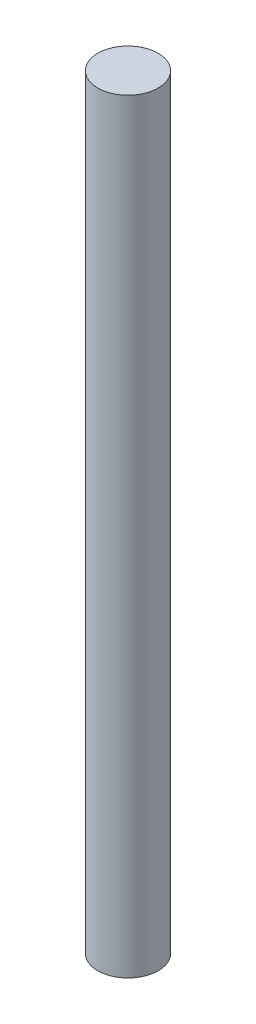
ISO-10303-21;
HEADER;
FILE_DESCRIPTION(('STEP AP214'),'2;1');
FILE_NAME('part.step','',(''),(''),'','','');
FILE_SCHEMA(('AUTOMOTIVE_DESIGN { 1 0 10303 214 1 1 1 1 }'));
ENDSEC;
DATA;
#1=APPLICATION_CONTEXT('core data for automotive mechanical design processes');
#2=APPLICATION_PROTOCOL_DEFINITION('international standard','automotive_design',2000,#1);
#3=PRODUCT_CONTEXT('',#1,'mechanical');
#4=PRODUCT('Part','Part','',(#3));
#5=PRODUCT_RELATED_PRODUCT_CATEGORY('part','',(#4));
#6=PRODUCT_DEFINITION_FORMATION('','',#4);
#7=PRODUCT_DEFINITION_CONTEXT('part definition',#1,'design');
#8=PRODUCT_DEFINITION('design','',#6,#7);
#9=PRODUCT_DEFINITION_SHAPE('','',#8);
#10=(LENGTH_UNIT() NAMED_UNIT(*) SI_UNIT(.MILLI.,.METRE.));
#11=(NAMED_UNIT(*) PLANE_ANGLE_UNIT() SI_UNIT($,.RADIAN.));
#12=(NAMED_UNIT(*) SI_UNIT($,.STERADIAN.) SOLID_ANGLE_UNIT());
#13=UNCERTAINTY_MEASURE_WITH_UNIT(LENGTH_MEASURE(1.E-05),#10,'distance_accuracy_value','');
#14=(GEOMETRIC_REPRESENTATION_CONTEXT(3) GLOBAL_UNCERTAINTY_ASSIGNED_CONTEXT((#13)) GLOBAL_UNIT_ASSIGNED_CONTEXT((#10,
#11,#12)) REPRESENTATION_CONTEXT('',''));
#15=CARTESIAN_POINT('',(0.,0.,0.));
#16=DIRECTION('',(0.,0.,1.));
#17=DIRECTION('',(1.,0.,0.));
#18=AXIS2_PLACEMENT_3D('',#15,#16,#17);
#19=CARTESIAN_POINT('',(0.,38.,0.));
#20=DIRECTION('',(0.,-1.,0.));
#21=DIRECTION('',(0.,0.,-1.));
#22=AXIS2_PLACEMENT_3D('',#19,#20,#21);
#23=CYLINDRICAL_SURFACE('',#22,1.5);
#24=CARTESIAN_POINT('',(0.,38.,0.));
#25=DIRECTION('',(0.,1.,0.));
#26=DIRECTION('',(0.,0.,1.));
#27=AXIS2_PLACEMENT_3D('',#24,#25,#26);
#28=CIRCLE('',#27,1.5);
#29=CARTESIAN_POINT('',(0.,38.,1.5));
#30=VERTEX_POINT('',#29);
#31=EDGE_CURVE('E10',#30,#30,#28,.T.);
#32=ORIENTED_EDGE('',*,*,#31,.F.);
#33=EDGE_LOOP('',(#32));
#34=FACE_BOUND('',#33,.T.);
#35=CARTESIAN_POINT('',(0.,0.,0.));
#36=DIRECTION('',(0.,1.,0.));
#37=DIRECTION('',(0.,0.,1.));
#38=AXIS2_PLACEMENT_3D('',#35,#36,#37);
#39=CIRCLE('',#38,1.5);
#40=CARTESIAN_POINT('',(0.,0.,1.5));
#41=VERTEX_POINT('',#40);
#42=EDGE_CURVE('E33',#41,#41,#39,.T.);
#43=ORIENTED_EDGE('',*,*,#42,.T.);
#44=EDGE_LOOP('',(#43));
#45=FACE_BOUND('',#44,.T.);
#46=ADVANCED_FACE('F30',(#34,#45),#23,.T.);
#47=CARTESIAN_POINT('',(0.,38.,0.));
#48=DIRECTION('',(0.,1.,0.));
#49=DIRECTION('',(0.,0.,1.));
#50=AXIS2_PLACEMENT_3D('',#47,#48,#49);
#51=PLANE('',#50);
#52=ORIENTED_EDGE('',*,*,#31,.T.);
#53=EDGE_LOOP('',(#52));
#54=FACE_BOUND('',#53,.T.);
#55=ADVANCED_FACE('F45',(#54),#51,.T.);
#56=CARTESIAN_POINT('',(0.,0.,0.));
#57=DIRECTION('',(0.,1.,0.));
#58=DIRECTION('',(0.,0.,1.));
#59=AXIS2_PLACEMENT_3D('',#56,#57,#58);
#60=PLANE('',#59);
#61=ORIENTED_EDGE('',*,*,#42,.F.);
#62=EDGE_LOOP('',(#61));
#63=FACE_BOUND('',#62,.T.);
#64=ADVANCED_FACE('F43',(#63),#60,.F.);
#65=CLOSED_SHELL('',(#46,#55,#64));
#66=MANIFOLD_SOLID_BREP('B2',#65);
#67=ADVANCED_BREP_SHAPE_REPRESENTATION('',(#18,#66),#14);
#68=SHAPE_DEFINITION_REPRESENTATION(#9,#67);
ENDSEC;
END-ISO-10303-21;
